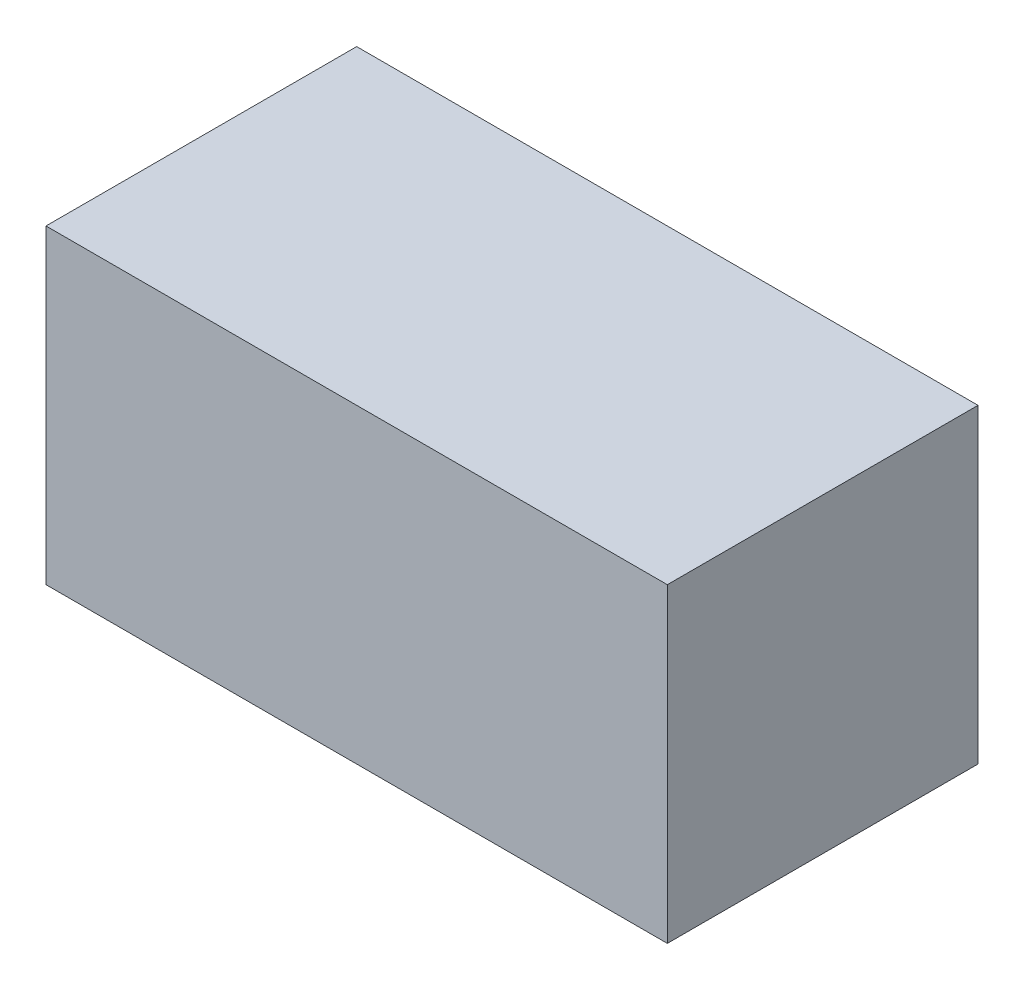
ISO-10303-21;
HEADER;
FILE_DESCRIPTION(('STEP AP214'),'2;1');
FILE_NAME('part.step','',(''),(''),'','','');
FILE_SCHEMA(('AUTOMOTIVE_DESIGN { 1 0 10303 214 1 1 1 1 }'));
ENDSEC;
DATA;
#1=APPLICATION_CONTEXT('core data for automotive mechanical design processes');
#2=APPLICATION_PROTOCOL_DEFINITION('international standard','automotive_design',2000,#1);
#3=PRODUCT_CONTEXT('',#1,'mechanical');
#4=PRODUCT('Part','Part','',(#3));
#5=PRODUCT_RELATED_PRODUCT_CATEGORY('part','',(#4));
#6=PRODUCT_DEFINITION_FORMATION('','',#4);
#7=PRODUCT_DEFINITION_CONTEXT('part definition',#1,'design');
#8=PRODUCT_DEFINITION('design','',#6,#7);
#9=PRODUCT_DEFINITION_SHAPE('','',#8);
#10=(LENGTH_UNIT() NAMED_UNIT(*) SI_UNIT(.MILLI.,.METRE.));
#11=(NAMED_UNIT(*) PLANE_ANGLE_UNIT() SI_UNIT($,.RADIAN.));
#12=(NAMED_UNIT(*) SI_UNIT($,.STERADIAN.) SOLID_ANGLE_UNIT());
#13=UNCERTAINTY_MEASURE_WITH_UNIT(LENGTH_MEASURE(1.E-05),#10,'distance_accuracy_value','');
#14=(GEOMETRIC_REPRESENTATION_CONTEXT(3) GLOBAL_UNCERTAINTY_ASSIGNED_CONTEXT((#13)) GLOBAL_UNIT_ASSIGNED_CONTEXT((#10,
#11,#12)) REPRESENTATION_CONTEXT('',''));
#15=CARTESIAN_POINT('',(0.,0.,0.));
#16=DIRECTION('',(0.,0.,1.));
#17=DIRECTION('',(1.,0.,0.));
#18=AXIS2_PLACEMENT_3D('',#15,#16,#17);
#19=CARTESIAN_POINT('',(0.,0.,5.));
#20=DIRECTION('',(1.,0.,0.));
#21=DIRECTION('',(0.,0.,-1.));
#22=AXIS2_PLACEMENT_3D('',#19,#20,#21);
#23=PLANE('',#22);
#24=DIRECTION('',(0.,-1.,0.));
#25=VECTOR('',#24,1.);
#26=CARTESIAN_POINT('',(0.,0.,0.));
#27=LINE('',#26,#25);
#28=CARTESIAN_POINT('',(0.,5.,0.));
#29=VERTEX_POINT('',#28);
#30=CARTESIAN_POINT('',(0.,0.,0.));
#31=VERTEX_POINT('',#30);
#32=EDGE_CURVE('E96',#29,#31,#27,.T.);
#33=ORIENTED_EDGE('',*,*,#32,.T.);
#34=DIRECTION('',(0.,0.,-1.));
#35=VECTOR('',#34,1.);
#36=CARTESIAN_POINT('',(0.,0.,5.));
#37=LINE('',#36,#35);
#38=CARTESIAN_POINT('',(0.,0.,5.));
#39=VERTEX_POINT('',#38);
#40=EDGE_CURVE('E11',#39,#31,#37,.T.);
#41=ORIENTED_EDGE('',*,*,#40,.F.);
#42=DIRECTION('',(0.,-1.,0.));
#43=VECTOR('',#42,1.);
#44=CARTESIAN_POINT('',(0.,0.,5.));
#45=LINE('',#44,#43);
#46=CARTESIAN_POINT('',(0.,5.,5.));
#47=VERTEX_POINT('',#46);
#48=EDGE_CURVE('E84',#47,#39,#45,.T.);
#49=ORIENTED_EDGE('',*,*,#48,.F.);
#50=DIRECTION('',(0.,0.,-1.));
#51=VECTOR('',#50,1.);
#52=CARTESIAN_POINT('',(0.,5.,5.));
#53=LINE('',#52,#51);
#54=EDGE_CURVE('E92',#47,#29,#53,.T.);
#55=ORIENTED_EDGE('',*,*,#54,.T.);
#56=EDGE_LOOP('',(#33,#41,#49,#55));
#57=FACE_BOUND('',#56,.T.);
#58=ADVANCED_FACE('F33',(#57),#23,.F.);
#59=CARTESIAN_POINT('',(0.,0.,5.));
#60=DIRECTION('',(0.,1.,0.));
#61=DIRECTION('',(0.,0.,1.));
#62=AXIS2_PLACEMENT_3D('',#59,#60,#61);
#63=PLANE('',#62);
#64=DIRECTION('',(1.,0.,0.));
#65=VECTOR('',#64,1.);
#66=CARTESIAN_POINT('',(0.,0.,0.));
#67=LINE('',#66,#65);
#68=CARTESIAN_POINT('',(10.,0.,0.));
#69=VERTEX_POINT('',#68);
#70=EDGE_CURVE('E88',#31,#69,#67,.T.);
#71=ORIENTED_EDGE('',*,*,#70,.T.);
#72=DIRECTION('',(0.,0.,-1.));
#73=VECTOR('',#72,1.);
#74=CARTESIAN_POINT('',(10.,0.,5.));
#75=LINE('',#74,#73);
#76=CARTESIAN_POINT('',(10.,0.,5.));
#77=VERTEX_POINT('',#76);
#78=EDGE_CURVE('E41',#77,#69,#75,.T.);
#79=ORIENTED_EDGE('',*,*,#78,.F.);
#80=DIRECTION('',(1.,0.,0.));
#81=VECTOR('',#80,1.);
#82=CARTESIAN_POINT('',(0.,0.,5.));
#83=LINE('',#82,#81);
#84=EDGE_CURVE('E79',#39,#77,#83,.T.);
#85=ORIENTED_EDGE('',*,*,#84,.F.);
#86=ORIENTED_EDGE('',*,*,#40,.T.);
#87=EDGE_LOOP('',(#71,#79,#85,#86));
#88=FACE_BOUND('',#87,.T.);
#89=ADVANCED_FACE('F87',(#88),#63,.F.);
#90=CARTESIAN_POINT('',(10.,0.,5.));
#91=DIRECTION('',(-1.,0.,0.));
#92=DIRECTION('',(0.,0.,1.));
#93=AXIS2_PLACEMENT_3D('',#90,#91,#92);
#94=PLANE('',#93);
#95=DIRECTION('',(0.,1.,0.));
#96=VECTOR('',#95,1.);
#97=CARTESIAN_POINT('',(10.,0.,0.));
#98=LINE('',#97,#96);
#99=CARTESIAN_POINT('',(10.,5.,0.));
#100=VERTEX_POINT('',#99);
#101=EDGE_CURVE('E66',#69,#100,#98,.T.);
#102=ORIENTED_EDGE('',*,*,#101,.T.);
#103=DIRECTION('',(0.,0.,-1.));
#104=VECTOR('',#103,1.);
#105=CARTESIAN_POINT('',(10.,5.,5.));
#106=LINE('',#105,#104);
#107=CARTESIAN_POINT('',(10.,5.,5.));
#108=VERTEX_POINT('',#107);
#109=EDGE_CURVE('E89',#108,#100,#106,.T.);
#110=ORIENTED_EDGE('',*,*,#109,.F.);
#111=DIRECTION('',(0.,1.,0.));
#112=VECTOR('',#111,1.);
#113=CARTESIAN_POINT('',(10.,0.,5.));
#114=LINE('',#113,#112);
#115=EDGE_CURVE('E82',#77,#108,#114,.T.);
#116=ORIENTED_EDGE('',*,*,#115,.F.);
#117=ORIENTED_EDGE('',*,*,#78,.T.);
#118=EDGE_LOOP('',(#102,#110,#116,#117));
#119=FACE_BOUND('',#118,.T.);
#120=ADVANCED_FACE('F90',(#119),#94,.F.);
#121=CARTESIAN_POINT('',(0.,5.,5.));
#122=DIRECTION('',(0.,-1.,0.));
#123=DIRECTION('',(0.,0.,-1.));
#124=AXIS2_PLACEMENT_3D('',#121,#122,#123);
#125=PLANE('',#124);
#126=DIRECTION('',(-1.,0.,0.));
#127=VECTOR('',#126,1.);
#128=CARTESIAN_POINT('',(0.,5.,0.));
#129=LINE('',#128,#127);
#130=EDGE_CURVE('E72',#100,#29,#129,.T.);
#131=ORIENTED_EDGE('',*,*,#130,.T.);
#132=ORIENTED_EDGE('',*,*,#54,.F.);
#133=DIRECTION('',(-1.,0.,0.));
#134=VECTOR('',#133,1.);
#135=CARTESIAN_POINT('',(0.,5.,5.));
#136=LINE('',#135,#134);
#137=EDGE_CURVE('E49',#108,#47,#136,.T.);
#138=ORIENTED_EDGE('',*,*,#137,.F.);
#139=ORIENTED_EDGE('',*,*,#109,.T.);
#140=EDGE_LOOP('',(#131,#132,#138,#139));
#141=FACE_BOUND('',#140,.T.);
#142=ADVANCED_FACE('F103',(#141),#125,.F.);
#143=CARTESIAN_POINT('',(0.,0.,5.));
#144=DIRECTION('',(0.,0.,-1.));
#145=DIRECTION('',(-1.,0.,0.));
#146=AXIS2_PLACEMENT_3D('',#143,#144,#145);
#147=PLANE('',#146);
#148=ORIENTED_EDGE('',*,*,#48,.T.);
#149=ORIENTED_EDGE('',*,*,#84,.T.);
#150=ORIENTED_EDGE('',*,*,#115,.T.);
#151=ORIENTED_EDGE('',*,*,#137,.T.);
#152=EDGE_LOOP('',(#148,#149,#150,#151));
#153=FACE_BOUND('',#152,.T.);
#154=ADVANCED_FACE('F80',(#153),#147,.F.);
#155=CARTESIAN_POINT('',(0.,0.,0.));
#156=DIRECTION('',(0.,0.,-1.));
#157=DIRECTION('',(-1.,0.,0.));
#158=AXIS2_PLACEMENT_3D('',#155,#156,#157);
#159=PLANE('',#158);
#160=ORIENTED_EDGE('',*,*,#32,.F.);
#161=ORIENTED_EDGE('',*,*,#130,.F.);
#162=ORIENTED_EDGE('',*,*,#101,.F.);
#163=ORIENTED_EDGE('',*,*,#70,.F.);
#164=EDGE_LOOP('',(#160,#161,#162,#163));
#165=FACE_BOUND('',#164,.T.);
#166=ADVANCED_FACE('F106',(#165),#159,.T.);
#167=CLOSED_SHELL('',(#58,#89,#120,#142,#154,#166));
#168=MANIFOLD_SOLID_BREP('B2',#167);
#169=ADVANCED_BREP_SHAPE_REPRESENTATION('',(#18,#168),#14);
#170=SHAPE_DEFINITION_REPRESENTATION(#9,#169);
ENDSEC;
END-ISO-10303-21;
